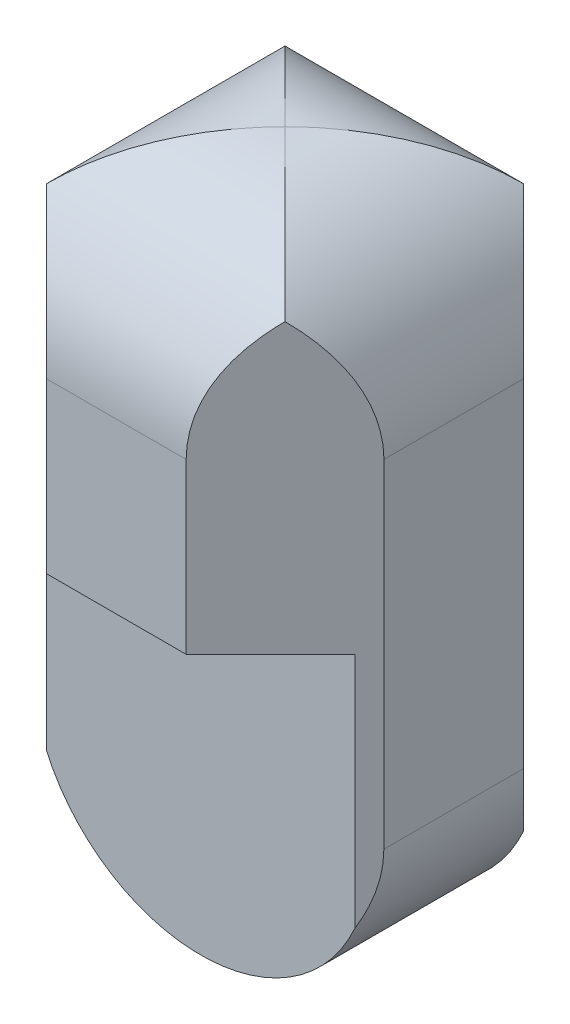
ISO-10303-21;
HEADER;
FILE_DESCRIPTION(('STEP AP214'),'2;1');
FILE_NAME('part.step','',(''),(''),'','','');
FILE_SCHEMA(('AUTOMOTIVE_DESIGN { 1 0 10303 214 1 1 1 1 }'));
ENDSEC;
DATA;
#1=APPLICATION_CONTEXT('core data for automotive mechanical design processes');
#2=APPLICATION_PROTOCOL_DEFINITION('international standard','automotive_design',2000,#1);
#3=PRODUCT_CONTEXT('',#1,'mechanical');
#4=PRODUCT('Part','Part','',(#3));
#5=PRODUCT_RELATED_PRODUCT_CATEGORY('part','',(#4));
#6=PRODUCT_DEFINITION_FORMATION('','',#4);
#7=PRODUCT_DEFINITION_CONTEXT('part definition',#1,'design');
#8=PRODUCT_DEFINITION('design','',#6,#7);
#9=PRODUCT_DEFINITION_SHAPE('','',#8);
#10=(LENGTH_UNIT() NAMED_UNIT(*) SI_UNIT(.MILLI.,.METRE.));
#11=(NAMED_UNIT(*) PLANE_ANGLE_UNIT() SI_UNIT($,.RADIAN.));
#12=(NAMED_UNIT(*) SI_UNIT($,.STERADIAN.) SOLID_ANGLE_UNIT());
#13=UNCERTAINTY_MEASURE_WITH_UNIT(LENGTH_MEASURE(1.E-05),#10,'distance_accuracy_value','');
#14=(GEOMETRIC_REPRESENTATION_CONTEXT(3) GLOBAL_UNCERTAINTY_ASSIGNED_CONTEXT((#13)) GLOBAL_UNIT_ASSIGNED_CONTEXT((#10,
#11,#12)) REPRESENTATION_CONTEXT('',''));
#15=CARTESIAN_POINT('',(0.,0.,0.));
#16=DIRECTION('',(0.,0.,1.));
#17=DIRECTION('',(1.,0.,0.));
#18=AXIS2_PLACEMENT_3D('',#15,#16,#17);
#19=CARTESIAN_POINT('',(4.14213562373094,42.,-10.));
#20=DIRECTION('',(0.,0.,1.));
#21=DIRECTION('',(1.,0.,0.));
#22=AXIS2_PLACEMENT_3D('',#19,#20,#21);
#23=PLANE('',#22);
#24=DIRECTION('',(1.,0.,0.));
#25=VECTOR('',#24,1.);
#26=CARTESIAN_POINT('',(-20.,30.,-9.99999999999999));
#27=LINE('',#26,#25);
#28=CARTESIAN_POINT('',(-4.14213562373095,30.,-10.));
#29=VERTEX_POINT('',#28);
#30=CARTESIAN_POINT('',(4.14213562373095,30.,-10.));
#31=VERTEX_POINT('',#30);
#32=EDGE_CURVE('E138',#29,#31,#27,.T.);
#33=ORIENTED_EDGE('',*,*,#32,.T.);
#34=DIRECTION('',(0.,-1.,0.));
#35=VECTOR('',#34,1.);
#36=CARTESIAN_POINT('',(4.14213562373094,42.,-10.));
#37=LINE('',#36,#35);
#38=CARTESIAN_POINT('',(4.14213562373094,20.,-10.));
#39=VERTEX_POINT('',#38);
#40=EDGE_CURVE('E163',#31,#39,#37,.T.);
#41=ORIENTED_EDGE('',*,*,#40,.T.);
#42=DIRECTION('',(1.,0.,0.));
#43=VECTOR('',#42,1.);
#44=CARTESIAN_POINT('',(10.,20.,-10.));
#45=LINE('',#44,#43);
#46=CARTESIAN_POINT('',(-4.14213562373096,20.,-10.));
#47=VERTEX_POINT('',#46);
#48=EDGE_CURVE('E162',#47,#39,#45,.T.);
#49=ORIENTED_EDGE('',*,*,#48,.F.);
#50=DIRECTION('',(0.,-1.,0.));
#51=VECTOR('',#50,1.);
#52=CARTESIAN_POINT('',(-4.14213562373096,42.,-10.));
#53=LINE('',#52,#51);
#54=EDGE_CURVE('E154',#29,#47,#53,.T.);
#55=ORIENTED_EDGE('',*,*,#54,.F.);
#56=EDGE_LOOP('',(#33,#41,#49,#55));
#57=FACE_BOUND('',#56,.T.);
#58=ADVANCED_FACE('F34',(#57),#23,.F.);
#59=CARTESIAN_POINT('',(0.,30.,-20.));
#60=DIRECTION('',(0.,0.,1.));
#61=DIRECTION('',(1.,0.,0.));
#62=AXIS2_PLACEMENT_3D('',#59,#60,#61);
#63=CYLINDRICAL_SURFACE('',#62,10.);
#64=CARTESIAN_POINT('',(0.,30.,-14.1421356237309));
#65=DIRECTION('',(-0.707106781186547,0.,0.707106781186548));
#66=DIRECTION('',(0.707106781186548,0.,0.707106781186547));
#67=AXIS2_PLACEMENT_3D('',#64,#65,#66);
#68=ELLIPSE('',#67,14.1421356237309,10.);
#69=CARTESIAN_POINT('',(7.07106781186547,37.0710678118655,-7.07106781186548));
#70=VERTEX_POINT('',#69);
#71=CARTESIAN_POINT('',(10.,30.,-4.14213562373095));
#72=VERTEX_POINT('',#71);
#73=EDGE_CURVE('E193',#70,#72,#68,.F.);
#74=ORIENTED_EDGE('',*,*,#73,.F.);
#75=CARTESIAN_POINT('',(0.,30.,0.));
#76=DIRECTION('',(0.707106781186548,0.,0.707106781186547));
#77=DIRECTION('',(-0.707106781186547,0.,0.707106781186548));
#78=AXIS2_PLACEMENT_3D('',#75,#76,#77);
#79=ELLIPSE('',#78,14.142135623731,10.);
#80=CARTESIAN_POINT('',(0.,40.,0.));
#81=VERTEX_POINT('',#80);
#82=EDGE_CURVE('E42',#70,#81,#79,.T.);
#83=ORIENTED_EDGE('',*,*,#82,.T.);
#84=CARTESIAN_POINT('',(0.,30.,0.));
#85=DIRECTION('',(-0.707106781186547,0.,0.707106781186548));
#86=DIRECTION('',(0.707106781186548,0.,0.707106781186547));
#87=AXIS2_PLACEMENT_3D('',#84,#85,#86);
#88=ELLIPSE('',#87,14.1421356237309,10.);
#89=CARTESIAN_POINT('',(7.07106781186548,37.0710678118655,7.07106781186547));
#90=VERTEX_POINT('',#89);
#91=EDGE_CURVE('E185',#81,#90,#88,.F.);
#92=ORIENTED_EDGE('',*,*,#91,.T.);
#93=CARTESIAN_POINT('',(0.,30.,14.1421356237309));
#94=DIRECTION('',(-0.707106781186547,0.,-0.707106781186548));
#95=DIRECTION('',(-0.707106781186548,0.,0.707106781186547));
#96=AXIS2_PLACEMENT_3D('',#93,#94,#95);
#97=ELLIPSE('',#96,14.1421356237309,10.);
#98=CARTESIAN_POINT('',(10.,30.,4.14213562373096));
#99=VERTEX_POINT('',#98);
#100=EDGE_CURVE('E182',#99,#90,#97,.F.);
#101=ORIENTED_EDGE('',*,*,#100,.F.);
#102=DIRECTION('',(0.,0.,1.));
#103=VECTOR('',#102,1.);
#104=CARTESIAN_POINT('',(10.,30.,-20.));
#105=LINE('',#104,#103);
#106=EDGE_CURVE('E208',#72,#99,#105,.T.);
#107=ORIENTED_EDGE('',*,*,#106,.F.);
#108=EDGE_LOOP('',(#74,#83,#92,#101,#107));
#109=FACE_BOUND('',#108,.T.);
#110=ADVANCED_FACE('F191',(#109),#63,.T.);
#111=CARTESIAN_POINT('',(-4.14213562373096,42.,10.));
#112=DIRECTION('',(0.,0.,-1.));
#113=DIRECTION('',(-1.,0.,0.));
#114=AXIS2_PLACEMENT_3D('',#111,#112,#113);
#115=PLANE('',#114);
#116=DIRECTION('',(0.,-1.,0.));
#117=VECTOR('',#116,1.);
#118=CARTESIAN_POINT('',(4.14213562373096,42.,10.));
#119=LINE('',#118,#117);
#120=CARTESIAN_POINT('',(4.14213562373095,30.,9.99999999999999));
#121=VERTEX_POINT('',#120);
#122=CARTESIAN_POINT('',(4.14213562373096,20.,10.));
#123=VERTEX_POINT('',#122);
#124=EDGE_CURVE('E261',#121,#123,#119,.T.);
#125=ORIENTED_EDGE('',*,*,#124,.F.);
#126=DIRECTION('',(1.,0.,0.));
#127=VECTOR('',#126,1.);
#128=CARTESIAN_POINT('',(-20.,30.,10.));
#129=LINE('',#128,#127);
#130=CARTESIAN_POINT('',(-4.14213562373096,30.,10.));
#131=VERTEX_POINT('',#130);
#132=EDGE_CURVE('E148',#131,#121,#129,.T.);
#133=ORIENTED_EDGE('',*,*,#132,.F.);
#134=DIRECTION('',(0.,-1.,0.));
#135=VECTOR('',#134,1.);
#136=CARTESIAN_POINT('',(-4.14213562373096,42.,10.));
#137=LINE('',#136,#135);
#138=CARTESIAN_POINT('',(-4.14213562373096,20.,10.));
#139=VERTEX_POINT('',#138);
#140=EDGE_CURVE('E206',#131,#139,#137,.T.);
#141=ORIENTED_EDGE('',*,*,#140,.T.);
#142=DIRECTION('',(-1.,0.,0.));
#143=VECTOR('',#142,1.);
#144=CARTESIAN_POINT('',(-10.,20.,10.));
#145=LINE('',#144,#143);
#146=EDGE_CURVE('E229',#123,#139,#145,.T.);
#147=ORIENTED_EDGE('',*,*,#146,.F.);
#148=EDGE_LOOP('',(#125,#133,#141,#147));
#149=FACE_BOUND('',#148,.T.);
#150=ADVANCED_FACE('F295',(#149),#115,.F.);
#151=CARTESIAN_POINT('',(10.,42.,4.14213562373095));
#152=DIRECTION('',(-1.,0.,0.));
#153=DIRECTION('',(0.,0.,1.));
#154=AXIS2_PLACEMENT_3D('',#151,#152,#153);
#155=PLANE('',#154);
#156=ORIENTED_EDGE('',*,*,#106,.T.);
#157=DIRECTION('',(0.,-1.,0.));
#158=VECTOR('',#157,1.);
#159=CARTESIAN_POINT('',(10.,42.,4.14213562373095));
#160=LINE('',#159,#158);
#161=CARTESIAN_POINT('',(10.,10.,4.14213562373095));
#162=VERTEX_POINT('',#161);
#163=EDGE_CURVE('E259',#99,#162,#160,.T.);
#164=ORIENTED_EDGE('',*,*,#163,.T.);
#165=DIRECTION('',(0.,0.,1.));
#166=VECTOR('',#165,1.);
#167=CARTESIAN_POINT('',(10.,10.,-56.));
#168=LINE('',#167,#166);
#169=CARTESIAN_POINT('',(10.,10.,-4.14213562373095));
#170=VERTEX_POINT('',#169);
#171=EDGE_CURVE('E242',#170,#162,#168,.T.);
#172=ORIENTED_EDGE('',*,*,#171,.F.);
#173=DIRECTION('',(0.,-1.,0.));
#174=VECTOR('',#173,1.);
#175=CARTESIAN_POINT('',(10.,42.,-4.14213562373095));
#176=LINE('',#175,#174);
#177=EDGE_CURVE('E166',#72,#170,#176,.T.);
#178=ORIENTED_EDGE('',*,*,#177,.F.);
#179=EDGE_LOOP('',(#156,#164,#172,#178));
#180=FACE_BOUND('',#179,.T.);
#181=ADVANCED_FACE('F36',(#180),#155,.F.);
#182=CARTESIAN_POINT('',(0.,10.,-56.));
#183=DIRECTION('',(0.,0.,1.));
#184=DIRECTION('',(1.,0.,0.));
#185=AXIS2_PLACEMENT_3D('',#182,#183,#184);
#186=CYLINDRICAL_SURFACE('',#185,10.);
#187=CARTESIAN_POINT('',(0.,10.,-5.));
#188=DIRECTION('',(0.,0.,-1.));
#189=DIRECTION('',(-1.,0.,0.));
#190=AXIS2_PLACEMENT_3D('',#187,#188,#189);
#191=CIRCLE('',#190,10.);
#192=CARTESIAN_POINT('',(9.14213562373095,5.94767273812816,-5.00000000000001));
#193=VERTEX_POINT('',#192);
#194=CARTESIAN_POINT('',(-9.14213562373096,5.94767273812821,-5.));
#195=VERTEX_POINT('',#194);
#196=EDGE_CURVE('E57',#193,#195,#191,.T.);
#197=ORIENTED_EDGE('',*,*,#196,.F.);
#198=CARTESIAN_POINT('',(0.,10.,-14.1421356237309));
#199=DIRECTION('',(-0.707106781186547,0.,0.707106781186548));
#200=DIRECTION('',(0.707106781186548,0.,0.707106781186547));
#201=AXIS2_PLACEMENT_3D('',#198,#199,#200);
#202=ELLIPSE('',#201,14.1421356237309,10.);
#203=EDGE_CURVE('E256',#170,#193,#202,.F.);
#204=ORIENTED_EDGE('',*,*,#203,.F.);
#205=ORIENTED_EDGE('',*,*,#171,.T.);
#206=CARTESIAN_POINT('',(0.,10.,14.1421356237309));
#207=DIRECTION('',(-0.707106781186547,0.,-0.707106781186548));
#208=DIRECTION('',(-0.707106781186548,0.,0.707106781186547));
#209=AXIS2_PLACEMENT_3D('',#206,#207,#208);
#210=ELLIPSE('',#209,14.1421356237309,10.);
#211=CARTESIAN_POINT('',(9.14213562373095,5.94767273812818,5.));
#212=VERTEX_POINT('',#211);
#213=EDGE_CURVE('E250',#212,#162,#210,.F.);
#214=ORIENTED_EDGE('',*,*,#213,.F.);
#215=CARTESIAN_POINT('',(0.,10.,5.));
#216=DIRECTION('',(0.,0.,1.));
#217=DIRECTION('',(1.,0.,0.));
#218=AXIS2_PLACEMENT_3D('',#215,#216,#217);
#219=CIRCLE('',#218,10.);
#220=CARTESIAN_POINT('',(-9.14213562373095,5.94767273812819,5.00000000000001));
#221=VERTEX_POINT('',#220);
#222=EDGE_CURVE('E173',#221,#212,#219,.T.);
#223=ORIENTED_EDGE('',*,*,#222,.F.);
#224=CARTESIAN_POINT('',(0.,10.,14.142135623731));
#225=DIRECTION('',(0.707106781186548,0.,-0.707106781186547));
#226=DIRECTION('',(0.707106781186547,0.,0.707106781186548));
#227=AXIS2_PLACEMENT_3D('',#224,#225,#226);
#228=ELLIPSE('',#227,14.142135623731,10.);
#229=CARTESIAN_POINT('',(-10.,10.,4.14213562373096));
#230=VERTEX_POINT('',#229);
#231=EDGE_CURVE('E253',#230,#221,#228,.F.);
#232=ORIENTED_EDGE('',*,*,#231,.F.);
#233=DIRECTION('',(0.,0.,1.));
#234=VECTOR('',#233,1.);
#235=CARTESIAN_POINT('',(-10.,10.,-56.));
#236=LINE('',#235,#234);
#237=CARTESIAN_POINT('',(-10.,10.,-4.14213562373095));
#238=VERTEX_POINT('',#237);
#239=EDGE_CURVE('E241',#238,#230,#236,.T.);
#240=ORIENTED_EDGE('',*,*,#239,.F.);
#241=CARTESIAN_POINT('',(0.,10.,-14.142135623731));
#242=DIRECTION('',(0.707106781186547,0.,0.707106781186547));
#243=DIRECTION('',(-0.707106781186547,0.,0.707106781186548));
#244=AXIS2_PLACEMENT_3D('',#241,#242,#243);
#245=ELLIPSE('',#244,14.142135623731,10.);
#246=EDGE_CURVE('E245',#195,#238,#245,.F.);
#247=ORIENTED_EDGE('',*,*,#246,.F.);
#248=EDGE_LOOP('',(#197,#204,#205,#214,#223,#232,#240,#247));
#249=FACE_BOUND('',#248,.T.);
#250=ADVANCED_FACE('F271',(#249),#186,.T.);
#251=CARTESIAN_POINT('',(-10.,42.,-4.14213562373095));
#252=DIRECTION('',(1.,0.,0.));
#253=DIRECTION('',(0.,0.,-1.));
#254=AXIS2_PLACEMENT_3D('',#251,#252,#253);
#255=PLANE('',#254);
#256=DIRECTION('',(0.,-1.,0.));
#257=VECTOR('',#256,1.);
#258=CARTESIAN_POINT('',(-10.,42.,4.14213562373096));
#259=LINE('',#258,#257);
#260=CARTESIAN_POINT('',(-10.,30.,4.14213562373096));
#261=VERTEX_POINT('',#260);
#262=EDGE_CURVE('E168',#261,#230,#259,.T.);
#263=ORIENTED_EDGE('',*,*,#262,.F.);
#264=DIRECTION('',(0.,0.,1.));
#265=VECTOR('',#264,1.);
#266=CARTESIAN_POINT('',(-10.,30.,-20.));
#267=LINE('',#266,#265);
#268=CARTESIAN_POINT('',(-10.,30.,-4.14213562373095));
#269=VERTEX_POINT('',#268);
#270=EDGE_CURVE('E212',#269,#261,#267,.T.);
#271=ORIENTED_EDGE('',*,*,#270,.F.);
#272=DIRECTION('',(0.,-1.,0.));
#273=VECTOR('',#272,1.);
#274=CARTESIAN_POINT('',(-10.,42.,-4.14213562373095));
#275=LINE('',#274,#273);
#276=EDGE_CURVE('E164',#269,#238,#275,.T.);
#277=ORIENTED_EDGE('',*,*,#276,.T.);
#278=ORIENTED_EDGE('',*,*,#239,.T.);
#279=EDGE_LOOP('',(#263,#271,#277,#278));
#280=FACE_BOUND('',#279,.T.);
#281=ADVANCED_FACE('F274',(#280),#255,.F.);
#282=CARTESIAN_POINT('',(10.,42.,-4.14213562373095));
#283=DIRECTION('',(-0.707106781186547,0.,0.707106781186548));
#284=DIRECTION('',(0.707106781186548,0.,0.707106781186547));
#285=AXIS2_PLACEMENT_3D('',#282,#283,#284);
#286=PLANE('',#285);
#287=ORIENTED_EDGE('',*,*,#40,.F.);
#288=CARTESIAN_POINT('',(14.1421356237309,30.,0.));
#289=DIRECTION('',(-0.707106781186547,0.,0.707106781186548));
#290=DIRECTION('',(0.707106781186548,0.,0.707106781186547));
#291=AXIS2_PLACEMENT_3D('',#288,#289,#290);
#292=ELLIPSE('',#291,14.1421356237309,10.);
#293=EDGE_CURVE('E144',#31,#70,#292,.F.);
#294=ORIENTED_EDGE('',*,*,#293,.T.);
#295=ORIENTED_EDGE('',*,*,#73,.T.);
#296=ORIENTED_EDGE('',*,*,#177,.T.);
#297=ORIENTED_EDGE('',*,*,#203,.T.);
#298=DIRECTION('',(0.,-1.,0.));
#299=VECTOR('',#298,1.);
#300=CARTESIAN_POINT('',(9.14213562373095,42.,-5.00000000000001));
#301=LINE('',#300,#299);
#302=CARTESIAN_POINT('',(9.14213562373095,20.,-5.00000000000001));
#303=VERTEX_POINT('',#302);
#304=EDGE_CURVE('E223',#303,#193,#301,.T.);
#305=ORIENTED_EDGE('',*,*,#304,.F.);
#306=DIRECTION('',(-0.707106781186548,0.,-0.707106781186547));
#307=VECTOR('',#306,1.);
#308=CARTESIAN_POINT('',(10.,20.,-4.14213562373095));
#309=LINE('',#308,#307);
#310=EDGE_CURVE('E226',#303,#39,#309,.T.);
#311=ORIENTED_EDGE('',*,*,#310,.T.);
#312=EDGE_LOOP('',(#287,#294,#295,#296,#297,#305,#311));
#313=FACE_BOUND('',#312,.T.);
#314=ADVANCED_FACE('F279',(#313),#286,.F.);
#315=CARTESIAN_POINT('',(-4.14213562373096,42.,-10.));
#316=DIRECTION('',(0.707106781186547,0.,0.707106781186547));
#317=DIRECTION('',(0.707106781186547,0.,-0.707106781186548));
#318=AXIS2_PLACEMENT_3D('',#315,#316,#317);
#319=PLANE('',#318);
#320=CARTESIAN_POINT('',(0.,30.,-14.142135623731));
#321=DIRECTION('',(0.707106781186547,0.,0.707106781186547));
#322=DIRECTION('',(-0.707106781186547,0.,0.707106781186548));
#323=AXIS2_PLACEMENT_3D('',#320,#321,#322);
#324=ELLIPSE('',#323,14.142135623731,10.);
#325=CARTESIAN_POINT('',(-7.07106781186548,37.0710678118655,-7.07106781186548));
#326=VERTEX_POINT('',#325);
#327=EDGE_CURVE('E157',#269,#326,#324,.F.);
#328=ORIENTED_EDGE('',*,*,#327,.T.);
#329=CARTESIAN_POINT('',(-14.142135623731,30.,0.));
#330=DIRECTION('',(0.707106781186547,0.,0.707106781186547));
#331=DIRECTION('',(0.707106781186547,0.,-0.707106781186548));
#332=AXIS2_PLACEMENT_3D('',#329,#330,#331);
#333=ELLIPSE('',#332,14.142135623731,10.);
#334=EDGE_CURVE('E141',#326,#29,#333,.F.);
#335=ORIENTED_EDGE('',*,*,#334,.T.);
#336=ORIENTED_EDGE('',*,*,#54,.T.);
#337=DIRECTION('',(-0.707106781186547,0.,0.707106781186548));
#338=VECTOR('',#337,1.);
#339=CARTESIAN_POINT('',(-4.14213562373096,20.,-10.));
#340=LINE('',#339,#338);
#341=CARTESIAN_POINT('',(-9.14213562373096,20.,-5.));
#342=VERTEX_POINT('',#341);
#343=EDGE_CURVE('E180',#47,#342,#340,.T.);
#344=ORIENTED_EDGE('',*,*,#343,.T.);
#345=DIRECTION('',(0.,1.,0.));
#346=VECTOR('',#345,1.);
#347=CARTESIAN_POINT('',(-9.14213562373096,42.,-5.));
#348=LINE('',#347,#346);
#349=EDGE_CURVE('E178',#195,#342,#348,.T.);
#350=ORIENTED_EDGE('',*,*,#349,.F.);
#351=ORIENTED_EDGE('',*,*,#246,.T.);
#352=ORIENTED_EDGE('',*,*,#276,.F.);
#353=EDGE_LOOP('',(#328,#335,#336,#344,#350,#351,#352));
#354=FACE_BOUND('',#353,.T.);
#355=ADVANCED_FACE('F152',(#354),#319,.F.);
#356=CARTESIAN_POINT('',(-10.,42.,4.14213562373096));
#357=DIRECTION('',(0.707106781186548,0.,-0.707106781186547));
#358=DIRECTION('',(-0.707106781186547,0.,-0.707106781186548));
#359=AXIS2_PLACEMENT_3D('',#356,#357,#358);
#360=PLANE('',#359);
#361=ORIENTED_EDGE('',*,*,#140,.F.);
#362=CARTESIAN_POINT('',(-14.1421356237309,30.,0.));
#363=DIRECTION('',(0.707106781186548,0.,-0.707106781186547));
#364=DIRECTION('',(0.707106781186547,0.,0.707106781186548));
#365=AXIS2_PLACEMENT_3D('',#362,#363,#364);
#366=ELLIPSE('',#365,14.1421356237309,10.);
#367=CARTESIAN_POINT('',(-7.07106781186548,37.0710678118655,7.07106781186548));
#368=VERTEX_POINT('',#367);
#369=EDGE_CURVE('E158',#131,#368,#366,.F.);
#370=ORIENTED_EDGE('',*,*,#369,.T.);
#371=CARTESIAN_POINT('',(0.,30.,14.142135623731));
#372=DIRECTION('',(0.707106781186548,0.,-0.707106781186547));
#373=DIRECTION('',(0.707106781186547,0.,0.707106781186548));
#374=AXIS2_PLACEMENT_3D('',#371,#372,#373);
#375=ELLIPSE('',#374,14.142135623731,10.);
#376=EDGE_CURVE('E198',#368,#261,#375,.F.);
#377=ORIENTED_EDGE('',*,*,#376,.T.);
#378=ORIENTED_EDGE('',*,*,#262,.T.);
#379=ORIENTED_EDGE('',*,*,#231,.T.);
#380=DIRECTION('',(0.,-1.,0.));
#381=VECTOR('',#380,1.);
#382=CARTESIAN_POINT('',(-9.14213562373095,42.,5.));
#383=LINE('',#382,#381);
#384=CARTESIAN_POINT('',(-9.14213562373095,20.,5.));
#385=VERTEX_POINT('',#384);
#386=EDGE_CURVE('E237',#385,#221,#383,.T.);
#387=ORIENTED_EDGE('',*,*,#386,.F.);
#388=DIRECTION('',(0.707106781186547,0.,0.707106781186548));
#389=VECTOR('',#388,1.);
#390=CARTESIAN_POINT('',(-10.,20.,4.14213562373096));
#391=LINE('',#390,#389);
#392=EDGE_CURVE('E239',#385,#139,#391,.T.);
#393=ORIENTED_EDGE('',*,*,#392,.T.);
#394=EDGE_LOOP('',(#361,#370,#377,#378,#379,#387,#393));
#395=FACE_BOUND('',#394,.T.);
#396=ADVANCED_FACE('F204',(#395),#360,.F.);
#397=CARTESIAN_POINT('',(4.14213562373096,42.,10.));
#398=DIRECTION('',(-0.707106781186547,0.,-0.707106781186548));
#399=DIRECTION('',(-0.707106781186548,0.,0.707106781186547));
#400=AXIS2_PLACEMENT_3D('',#397,#398,#399);
#401=PLANE('',#400);
#402=ORIENTED_EDGE('',*,*,#100,.T.);
#403=CARTESIAN_POINT('',(14.142135623731,30.,0.));
#404=DIRECTION('',(-0.707106781186547,0.,-0.707106781186548));
#405=DIRECTION('',(0.707106781186548,0.,-0.707106781186547));
#406=AXIS2_PLACEMENT_3D('',#403,#404,#405);
#407=ELLIPSE('',#406,14.142135623731,10.);
#408=EDGE_CURVE('E49',#90,#121,#407,.F.);
#409=ORIENTED_EDGE('',*,*,#408,.T.);
#410=ORIENTED_EDGE('',*,*,#124,.T.);
#411=DIRECTION('',(0.707106781186548,0.,-0.707106781186547));
#412=VECTOR('',#411,1.);
#413=CARTESIAN_POINT('',(4.14213562373096,20.,10.));
#414=LINE('',#413,#412);
#415=CARTESIAN_POINT('',(9.14213562373096,20.,5.));
#416=VERTEX_POINT('',#415);
#417=EDGE_CURVE('E175',#123,#416,#414,.T.);
#418=ORIENTED_EDGE('',*,*,#417,.T.);
#419=DIRECTION('',(0.,1.,0.));
#420=VECTOR('',#419,1.);
#421=CARTESIAN_POINT('',(9.14213562373095,42.,5.));
#422=LINE('',#421,#420);
#423=EDGE_CURVE('E233',#212,#416,#422,.T.);
#424=ORIENTED_EDGE('',*,*,#423,.F.);
#425=ORIENTED_EDGE('',*,*,#213,.T.);
#426=ORIENTED_EDGE('',*,*,#163,.F.);
#427=EDGE_LOOP('',(#402,#409,#410,#418,#424,#425,#426));
#428=FACE_BOUND('',#427,.T.);
#429=ADVANCED_FACE('F285',(#428),#401,.F.);
#430=CARTESIAN_POINT('',(-10.,20.,5.));
#431=DIRECTION('',(0.,1.,0.));
#432=DIRECTION('',(0.,0.,1.));
#433=AXIS2_PLACEMENT_3D('',#430,#431,#432);
#434=PLANE('',#433);
#435=DIRECTION('',(-1.,0.,0.));
#436=VECTOR('',#435,1.);
#437=CARTESIAN_POINT('',(-10.,20.,5.));
#438=LINE('',#437,#436);
#439=EDGE_CURVE('E230',#416,#385,#438,.T.);
#440=ORIENTED_EDGE('',*,*,#439,.F.);
#441=ORIENTED_EDGE('',*,*,#417,.F.);
#442=ORIENTED_EDGE('',*,*,#146,.T.);
#443=ORIENTED_EDGE('',*,*,#392,.F.);
#444=EDGE_LOOP('',(#440,#441,#442,#443));
#445=FACE_BOUND('',#444,.T.);
#446=ADVANCED_FACE('F291',(#445),#434,.F.);
#447=CARTESIAN_POINT('',(0.,10.,5.));
#448=DIRECTION('',(0.,0.,1.));
#449=DIRECTION('',(1.,0.,0.));
#450=AXIS2_PLACEMENT_3D('',#447,#448,#449);
#451=PLANE('',#450);
#452=ORIENTED_EDGE('',*,*,#386,.T.);
#453=ORIENTED_EDGE('',*,*,#222,.T.);
#454=ORIENTED_EDGE('',*,*,#423,.T.);
#455=ORIENTED_EDGE('',*,*,#439,.T.);
#456=EDGE_LOOP('',(#452,#453,#454,#455));
#457=FACE_BOUND('',#456,.T.);
#458=ADVANCED_FACE('F289',(#457),#451,.T.);
#459=CARTESIAN_POINT('',(10.,20.,-5.00000000000001));
#460=DIRECTION('',(0.,1.,0.));
#461=DIRECTION('',(0.,0.,1.));
#462=AXIS2_PLACEMENT_3D('',#459,#460,#461);
#463=PLANE('',#462);
#464=DIRECTION('',(1.,0.,0.));
#465=VECTOR('',#464,1.);
#466=CARTESIAN_POINT('',(10.,20.,-5.00000000000001));
#467=LINE('',#466,#465);
#468=EDGE_CURVE('E220',#342,#303,#467,.T.);
#469=ORIENTED_EDGE('',*,*,#468,.F.);
#470=ORIENTED_EDGE('',*,*,#343,.F.);
#471=ORIENTED_EDGE('',*,*,#48,.T.);
#472=ORIENTED_EDGE('',*,*,#310,.F.);
#473=EDGE_LOOP('',(#469,#470,#471,#472));
#474=FACE_BOUND('',#473,.T.);
#475=ADVANCED_FACE('F332',(#474),#463,.F.);
#476=CARTESIAN_POINT('',(0.,10.,-5.));
#477=DIRECTION('',(0.,0.,-1.));
#478=DIRECTION('',(-1.,0.,0.));
#479=AXIS2_PLACEMENT_3D('',#476,#477,#478);
#480=PLANE('',#479);
#481=ORIENTED_EDGE('',*,*,#304,.T.);
#482=ORIENTED_EDGE('',*,*,#196,.T.);
#483=ORIENTED_EDGE('',*,*,#349,.T.);
#484=ORIENTED_EDGE('',*,*,#468,.T.);
#485=EDGE_LOOP('',(#481,#482,#483,#484));
#486=FACE_BOUND('',#485,.T.);
#487=ADVANCED_FACE('F335',(#486),#480,.T.);
#488=ORIENTED_EDGE('',*,*,#376,.F.);
#489=CARTESIAN_POINT('',(0.,30.,0.));
#490=DIRECTION('',(0.707106781186548,0.,0.707106781186547));
#491=DIRECTION('',(-0.707106781186547,0.,0.707106781186548));
#492=AXIS2_PLACEMENT_3D('',#489,#490,#491);
#493=ELLIPSE('',#492,14.142135623731,10.);
#494=EDGE_CURVE('E11',#368,#81,#493,.F.);
#495=ORIENTED_EDGE('',*,*,#494,.T.);
#496=CARTESIAN_POINT('',(0.,30.,0.));
#497=DIRECTION('',(-0.707106781186547,0.,0.707106781186548));
#498=DIRECTION('',(0.707106781186548,0.,0.707106781186547));
#499=AXIS2_PLACEMENT_3D('',#496,#497,#498);
#500=ELLIPSE('',#499,14.1421356237309,10.);
#501=EDGE_CURVE('E187',#81,#326,#500,.T.);
#502=ORIENTED_EDGE('',*,*,#501,.T.);
#503=ORIENTED_EDGE('',*,*,#327,.F.);
#504=ORIENTED_EDGE('',*,*,#270,.T.);
#505=EDGE_LOOP('',(#488,#495,#502,#503,#504));
#506=FACE_BOUND('',#505,.T.);
#507=ADVANCED_FACE('F196',(#506),#63,.T.);
#508=CARTESIAN_POINT('',(-20.,30.,0.));
#509=DIRECTION('',(1.,0.,0.));
#510=DIRECTION('',(0.,0.,-1.));
#511=AXIS2_PLACEMENT_3D('',#508,#509,#510);
#512=CYLINDRICAL_SURFACE('',#511,10.);
#513=ORIENTED_EDGE('',*,*,#132,.T.);
#514=ORIENTED_EDGE('',*,*,#408,.F.);
#515=ORIENTED_EDGE('',*,*,#91,.F.);
#516=ORIENTED_EDGE('',*,*,#494,.F.);
#517=ORIENTED_EDGE('',*,*,#369,.F.);
#518=EDGE_LOOP('',(#513,#514,#515,#516,#517));
#519=FACE_BOUND('',#518,.T.);
#520=ADVANCED_FACE('F200',(#519),#512,.T.);
#521=ORIENTED_EDGE('',*,*,#32,.F.);
#522=ORIENTED_EDGE('',*,*,#334,.F.);
#523=ORIENTED_EDGE('',*,*,#501,.F.);
#524=ORIENTED_EDGE('',*,*,#82,.F.);
#525=ORIENTED_EDGE('',*,*,#293,.F.);
#526=EDGE_LOOP('',(#521,#522,#523,#524,#525));
#527=FACE_BOUND('',#526,.T.);
#528=ADVANCED_FACE('F140',(#527),#512,.T.);
#529=CLOSED_SHELL('',(#58,#110,#150,#181,#250,#281,#314,#355,#396,#429,#446,#458,#475,#487,#507,
#520,#528));
#530=MANIFOLD_SOLID_BREP('B2',#529);
#531=ADVANCED_BREP_SHAPE_REPRESENTATION('',(#18,#530),#14);
#532=SHAPE_DEFINITION_REPRESENTATION(#9,#531);
ENDSEC;
END-ISO-10303-21;
